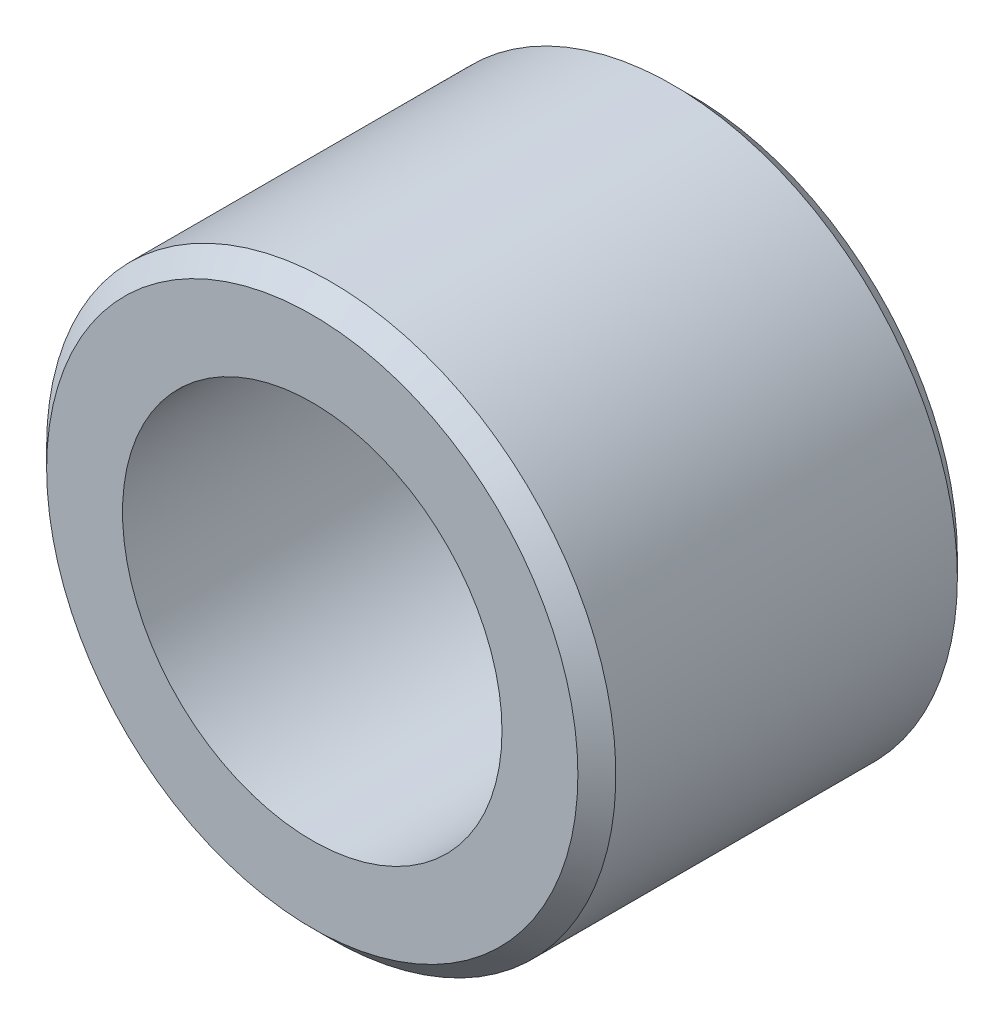
ISO-10303-21;
HEADER;
FILE_DESCRIPTION(('STEP AP214'),'2;1');
FILE_NAME('part.step','',(''),(''),'','','');
FILE_SCHEMA(('AUTOMOTIVE_DESIGN { 1 0 10303 214 1 1 1 1 }'));
ENDSEC;
DATA;
#1=APPLICATION_CONTEXT('core data for automotive mechanical design processes');
#2=APPLICATION_PROTOCOL_DEFINITION('international standard','automotive_design',2000,#1);
#3=PRODUCT_CONTEXT('',#1,'mechanical');
#4=PRODUCT('Part','Part','',(#3));
#5=PRODUCT_RELATED_PRODUCT_CATEGORY('part','',(#4));
#6=PRODUCT_DEFINITION_FORMATION('','',#4);
#7=PRODUCT_DEFINITION_CONTEXT('part definition',#1,'design');
#8=PRODUCT_DEFINITION('design','',#6,#7);
#9=PRODUCT_DEFINITION_SHAPE('','',#8);
#10=(LENGTH_UNIT() NAMED_UNIT(*) SI_UNIT(.MILLI.,.METRE.));
#11=(NAMED_UNIT(*) PLANE_ANGLE_UNIT() SI_UNIT($,.RADIAN.));
#12=(NAMED_UNIT(*) SI_UNIT($,.STERADIAN.) SOLID_ANGLE_UNIT());
#13=UNCERTAINTY_MEASURE_WITH_UNIT(LENGTH_MEASURE(1.E-05),#10,'distance_accuracy_value','');
#14=(GEOMETRIC_REPRESENTATION_CONTEXT(3) GLOBAL_UNCERTAINTY_ASSIGNED_CONTEXT((#13)) GLOBAL_UNIT_ASSIGNED_CONTEXT((#10,
#11,#12)) REPRESENTATION_CONTEXT('',''));
#15=CARTESIAN_POINT('',(0.,0.,0.));
#16=DIRECTION('',(0.,0.,1.));
#17=DIRECTION('',(1.,0.,0.));
#18=AXIS2_PLACEMENT_3D('',#15,#16,#17);
#19=CARTESIAN_POINT('',(0.,0.,2.));
#20=DIRECTION('',(0.,0.,1.));
#21=DIRECTION('',(1.,0.,0.));
#22=AXIS2_PLACEMENT_3D('',#19,#20,#21);
#23=PLANE('',#22);
#24=CARTESIAN_POINT('',(0.,0.,2.));
#25=DIRECTION('',(0.,0.,1.));
#26=DIRECTION('',(1.,0.,0.));
#27=AXIS2_PLACEMENT_3D('',#24,#25,#26);
#28=CIRCLE('',#27,1.4);
#29=CARTESIAN_POINT('',(-1.4,0.,2.));
#30=VERTEX_POINT('',#29);
#31=EDGE_CURVE('E10',#30,#30,#28,.T.);
#32=ORIENTED_EDGE('',*,*,#31,.T.);
#33=EDGE_LOOP('',(#32));
#34=FACE_BOUND('',#33,.T.);
#35=CARTESIAN_POINT('',(0.,0.,2.));
#36=DIRECTION('',(0.,0.,1.));
#37=DIRECTION('',(1.,0.,0.));
#38=AXIS2_PLACEMENT_3D('',#35,#36,#37);
#39=CIRCLE('',#38,1.);
#40=CARTESIAN_POINT('',(1.,0.,2.));
#41=VERTEX_POINT('',#40);
#42=EDGE_CURVE('E53',#41,#41,#39,.T.);
#43=ORIENTED_EDGE('',*,*,#42,.F.);
#44=EDGE_LOOP('',(#43));
#45=FACE_BOUND('',#44,.T.);
#46=ADVANCED_FACE('F33',(#34,#45),#23,.T.);
#47=CARTESIAN_POINT('',(0.,0.,0.));
#48=DIRECTION('',(0.,0.,1.));
#49=DIRECTION('',(1.,0.,0.));
#50=AXIS2_PLACEMENT_3D('',#47,#48,#49);
#51=PLANE('',#50);
#52=CARTESIAN_POINT('',(0.,0.,0.));
#53=DIRECTION('',(0.,0.,1.));
#54=DIRECTION('',(1.,0.,0.));
#55=AXIS2_PLACEMENT_3D('',#52,#53,#54);
#56=CIRCLE('',#55,1.4);
#57=CARTESIAN_POINT('',(1.4,0.,0.));
#58=VERTEX_POINT('',#57);
#59=EDGE_CURVE('E40',#58,#58,#56,.F.);
#60=ORIENTED_EDGE('',*,*,#59,.T.);
#61=EDGE_LOOP('',(#60));
#62=FACE_BOUND('',#61,.T.);
#63=CARTESIAN_POINT('',(0.,0.,0.));
#64=DIRECTION('',(0.,0.,1.));
#65=DIRECTION('',(1.,0.,0.));
#66=AXIS2_PLACEMENT_3D('',#63,#64,#65);
#67=CIRCLE('',#66,1.);
#68=CARTESIAN_POINT('',(1.,0.,0.));
#69=VERTEX_POINT('',#68);
#70=EDGE_CURVE('E54',#69,#69,#67,.T.);
#71=ORIENTED_EDGE('',*,*,#70,.T.);
#72=EDGE_LOOP('',(#71));
#73=FACE_BOUND('',#72,.T.);
#74=ADVANCED_FACE('F64',(#62,#73),#51,.F.);
#75=CARTESIAN_POINT('',(0.,0.,2.));
#76=DIRECTION('',(0.,0.,-1.));
#77=DIRECTION('',(-1.,0.,0.));
#78=AXIS2_PLACEMENT_3D('',#75,#76,#77);
#79=CYLINDRICAL_SURFACE('',#78,1.5);
#80=CARTESIAN_POINT('',(0.,0.,0.1));
#81=DIRECTION('',(0.,0.,1.));
#82=DIRECTION('',(1.,0.,0.));
#83=AXIS2_PLACEMENT_3D('',#80,#81,#82);
#84=CIRCLE('',#83,1.5);
#85=CARTESIAN_POINT('',(1.5,0.,0.1));
#86=VERTEX_POINT('',#85);
#87=EDGE_CURVE('E44',#86,#86,#84,.T.);
#88=ORIENTED_EDGE('',*,*,#87,.T.);
#89=EDGE_LOOP('',(#88));
#90=FACE_BOUND('',#89,.T.);
#91=CARTESIAN_POINT('',(0.,0.,1.9));
#92=DIRECTION('',(0.,0.,1.));
#93=DIRECTION('',(1.,0.,0.));
#94=AXIS2_PLACEMENT_3D('',#91,#92,#93);
#95=CIRCLE('',#94,1.5);
#96=CARTESIAN_POINT('',(-1.5,0.,1.9));
#97=VERTEX_POINT('',#96);
#98=EDGE_CURVE('E48',#97,#97,#95,.F.);
#99=ORIENTED_EDGE('',*,*,#98,.T.);
#100=EDGE_LOOP('',(#99));
#101=FACE_BOUND('',#100,.T.);
#102=ADVANCED_FACE('F69',(#90,#101),#79,.T.);
#103=CARTESIAN_POINT('',(0.,0.,2.));
#104=DIRECTION('',(0.,0.,-1.));
#105=DIRECTION('',(-1.,0.,0.));
#106=AXIS2_PLACEMENT_3D('',#103,#104,#105);
#107=CYLINDRICAL_SURFACE('',#106,1.);
#108=ORIENTED_EDGE('',*,*,#42,.T.);
#109=EDGE_LOOP('',(#108));
#110=FACE_BOUND('',#109,.T.);
#111=ORIENTED_EDGE('',*,*,#70,.F.);
#112=EDGE_LOOP('',(#111));
#113=FACE_BOUND('',#112,.T.);
#114=ADVANCED_FACE('F60',(#110,#113),#107,.F.);
#115=CARTESIAN_POINT('',(0.,0.,0.1));
#116=DIRECTION('',(0.,0.,1.));
#117=DIRECTION('',(1.,0.,0.));
#118=AXIS2_PLACEMENT_3D('',#115,#116,#117);
#119=CONICAL_SURFACE('',#118,1.5,0.785398163397448);
#120=ORIENTED_EDGE('',*,*,#59,.F.);
#121=EDGE_LOOP('',(#120));
#122=FACE_BOUND('',#121,.T.);
#123=ORIENTED_EDGE('',*,*,#87,.F.);
#124=EDGE_LOOP('',(#123));
#125=FACE_BOUND('',#124,.T.);
#126=ADVANCED_FACE('F75',(#122,#125),#119,.T.);
#127=CARTESIAN_POINT('',(0.,0.,2.));
#128=DIRECTION('',(0.,0.,-1.));
#129=DIRECTION('',(-1.,0.,0.));
#130=AXIS2_PLACEMENT_3D('',#127,#128,#129);
#131=CONICAL_SURFACE('',#130,1.4,0.785398163397446);
#132=CARTESIAN_POINT('',(-1.5,0.,1.9));
#133=CARTESIAN_POINT('',(-1.49895833333333,0.,1.90104166666667));
#134=CARTESIAN_POINT('',(-1.49791666666667,0.,1.90208333333333));
#135=CARTESIAN_POINT('',(-1.49583333333333,0.,1.90416666666667));
#136=CARTESIAN_POINT('',(-1.49479166666667,0.,1.90520833333333));
#137=CARTESIAN_POINT('',(-1.49270833333333,0.,1.90729166666667));
#138=CARTESIAN_POINT('',(-1.49166666666667,0.,1.90833333333333));
#139=CARTESIAN_POINT('',(-1.48958333333333,0.,1.91041666666667));
#140=CARTESIAN_POINT('',(-1.48854166666667,0.,1.91145833333333));
#141=CARTESIAN_POINT('',(-1.48645833333333,0.,1.91354166666667));
#142=CARTESIAN_POINT('',(-1.48541666666667,0.,1.91458333333333));
#143=CARTESIAN_POINT('',(-1.48333333333333,0.,1.91666666666667));
#144=CARTESIAN_POINT('',(-1.48229166666667,0.,1.91770833333333));
#145=CARTESIAN_POINT('',(-1.48020833333333,0.,1.91979166666667));
#146=CARTESIAN_POINT('',(-1.47916666666667,0.,1.92083333333333));
#147=CARTESIAN_POINT('',(-1.47708333333333,0.,1.92291666666667));
#148=CARTESIAN_POINT('',(-1.47604166666667,0.,1.92395833333333));
#149=CARTESIAN_POINT('',(-1.47395833333333,0.,1.92604166666667));
#150=CARTESIAN_POINT('',(-1.47291666666667,0.,1.92708333333333));
#151=CARTESIAN_POINT('',(-1.47083333333333,0.,1.92916666666667));
#152=CARTESIAN_POINT('',(-1.46979166666667,0.,1.93020833333333));
#153=CARTESIAN_POINT('',(-1.46770833333333,0.,1.93229166666667));
#154=CARTESIAN_POINT('',(-1.46666666666667,0.,1.93333333333333));
#155=CARTESIAN_POINT('',(-1.46458333333333,0.,1.93541666666667));
#156=CARTESIAN_POINT('',(-1.46354166666667,0.,1.93645833333333));
#157=CARTESIAN_POINT('',(-1.46145833333333,0.,1.93854166666667));
#158=CARTESIAN_POINT('',(-1.46041666666667,0.,1.93958333333333));
#159=CARTESIAN_POINT('',(-1.45833333333333,0.,1.94166666666667));
#160=CARTESIAN_POINT('',(-1.45729166666667,0.,1.94270833333333));
#161=CARTESIAN_POINT('',(-1.45520833333333,0.,1.94479166666667));
#162=CARTESIAN_POINT('',(-1.45416666666667,0.,1.94583333333333));
#163=CARTESIAN_POINT('',(-1.45208333333333,0.,1.94791666666667));
#164=CARTESIAN_POINT('',(-1.45104166666667,0.,1.94895833333333));
#165=CARTESIAN_POINT('',(-1.44895833333333,0.,1.95104166666667));
#166=CARTESIAN_POINT('',(-1.44791666666667,0.,1.95208333333333));
#167=CARTESIAN_POINT('',(-1.44583333333333,0.,1.95416666666667));
#168=CARTESIAN_POINT('',(-1.44479166666667,0.,1.95520833333333));
#169=CARTESIAN_POINT('',(-1.44270833333333,0.,1.95729166666667));
#170=CARTESIAN_POINT('',(-1.44166666666667,0.,1.95833333333333));
#171=CARTESIAN_POINT('',(-1.43958333333333,0.,1.96041666666667));
#172=CARTESIAN_POINT('',(-1.43854166666667,0.,1.96145833333333));
#173=CARTESIAN_POINT('',(-1.43645833333333,0.,1.96354166666667));
#174=CARTESIAN_POINT('',(-1.43541666666667,0.,1.96458333333333));
#175=CARTESIAN_POINT('',(-1.43333333333333,0.,1.96666666666667));
#176=CARTESIAN_POINT('',(-1.43229166666667,0.,1.96770833333333));
#177=CARTESIAN_POINT('',(-1.43020833333333,0.,1.96979166666667));
#178=CARTESIAN_POINT('',(-1.42916666666667,0.,1.97083333333333));
#179=CARTESIAN_POINT('',(-1.42708333333333,0.,1.97291666666667));
#180=CARTESIAN_POINT('',(-1.42604166666667,0.,1.97395833333333));
#181=CARTESIAN_POINT('',(-1.42395833333333,0.,1.97604166666667));
#182=CARTESIAN_POINT('',(-1.42291666666667,0.,1.97708333333333));
#183=CARTESIAN_POINT('',(-1.42083333333333,0.,1.97916666666667));
#184=CARTESIAN_POINT('',(-1.41979166666667,0.,1.98020833333333));
#185=CARTESIAN_POINT('',(-1.41770833333333,0.,1.98229166666667));
#186=CARTESIAN_POINT('',(-1.41666666666667,0.,1.98333333333333));
#187=CARTESIAN_POINT('',(-1.41458333333333,0.,1.98541666666667));
#188=CARTESIAN_POINT('',(-1.41354166666667,0.,1.98645833333333));
#189=CARTESIAN_POINT('',(-1.41145833333333,0.,1.98854166666667));
#190=CARTESIAN_POINT('',(-1.41041666666667,0.,1.98958333333333));
#191=CARTESIAN_POINT('',(-1.40833333333333,0.,1.99166666666667));
#192=CARTESIAN_POINT('',(-1.40729166666667,0.,1.99270833333333));
#193=CARTESIAN_POINT('',(-1.40520833333333,0.,1.99479166666667));
#194=CARTESIAN_POINT('',(-1.40416666666667,0.,1.99583333333333));
#195=CARTESIAN_POINT('',(-1.40208333333333,0.,1.99791666666667));
#196=CARTESIAN_POINT('',(-1.40104166666667,0.,1.99895833333333));
#197=CARTESIAN_POINT('',(-1.4,0.,2.));
#198=B_SPLINE_CURVE_WITH_KNOTS('',3,(#132,#133,#134,#135,#136,#137,#138,#139,#140,#141,#142,
#143,#144,#145,#146,#147,#148,#149,#150,#151,#152,#153,#154,#155,#156,#157,#158,#159,#160,#161,
#162,#163,#164,#165,#166,#167,#168,#169,#170,#171,#172,#173,#174,#175,#176,#177,#178,#179,#180,
#181,#182,#183,#184,#185,#186,#187,#188,#189,#190,#191,#192,#193,#194,#195,#196,#197),
.UNSPECIFIED.,.F.,.F.,(4,2,2,2,2,2,2,2,2,2,2,2,2,2,2,2,2,2,2,2,2,2,2,2,2,2,2,2,2,2,2,2,4),(0.,
0.00441941738241605,0.00883883476483194,0.0132582521472478,0.0176776695296637,
0.0220970869120796,0.0265165042944955,0.0309359216769114,0.0353553390593273,0.0397747564417432,
0.0441941738241591,0.048613591206575,0.0530330085889909,0.0574524259714069,0.0618718433538227,
0.0662912607362387,0.0707106781186545,0.0751300955010705,0.0795495128834864,0.0839689302659022,
0.0883883476483181,0.0928077650307341,0.09722718241315,0.101646599795566,0.106066017177982,
0.110485434560398,0.114904851942814,0.11932426932523,0.123743686707645,0.128163104090061,
0.132582521472477,0.137001938854893,0.141421356237309),.UNSPECIFIED.);
#199=EDGE_CURVE('BSEAM35',#97,#30,#198,.T.);
#200=ORIENTED_EDGE('',*,*,#98,.F.);
#201=ORIENTED_EDGE('',*,*,#31,.F.);
#202=ORIENTED_EDGE('',*,*,#199,.T.);
#203=ORIENTED_EDGE('',*,*,#199,.F.);
#204=EDGE_LOOP('',(#200,#202,#201,#203));
#205=FACE_BOUND('',#204,.T.);
#206=ADVANCED_FACE('F35',(#205),#131,.T.);
#207=CLOSED_SHELL('',(#46,#74,#102,#114,#126,#206));
#208=MANIFOLD_SOLID_BREP('B2',#207);
#209=ADVANCED_BREP_SHAPE_REPRESENTATION('',(#18,#208),#14);
#210=SHAPE_DEFINITION_REPRESENTATION(#9,#209);
ENDSEC;
END-ISO-10303-21;
